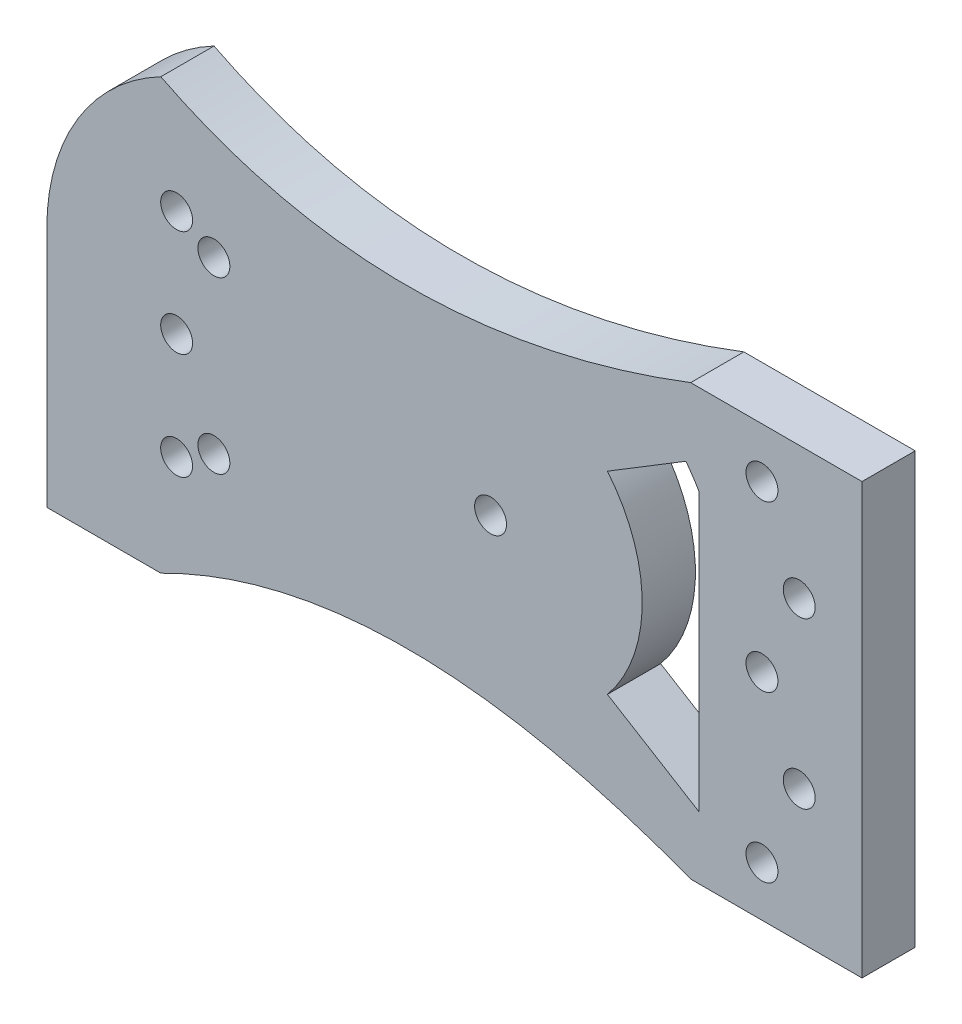
ISO-10303-21;
HEADER;
FILE_DESCRIPTION(('STEP AP214'),'2;1');
FILE_NAME('part.step','',(''),(''),'','','');
FILE_SCHEMA(('AUTOMOTIVE_DESIGN { 1 0 10303 214 1 1 1 1 }'));
ENDSEC;
DATA;
#1=APPLICATION_CONTEXT('core data for automotive mechanical design processes');
#2=APPLICATION_PROTOCOL_DEFINITION('international standard','automotive_design',2000,#1);
#3=PRODUCT_CONTEXT('',#1,'mechanical');
#4=PRODUCT('Part','Part','',(#3));
#5=PRODUCT_RELATED_PRODUCT_CATEGORY('part','',(#4));
#6=PRODUCT_DEFINITION_FORMATION('','',#4);
#7=PRODUCT_DEFINITION_CONTEXT('part definition',#1,'design');
#8=PRODUCT_DEFINITION('design','',#6,#7);
#9=PRODUCT_DEFINITION_SHAPE('','',#8);
#10=(LENGTH_UNIT() NAMED_UNIT(*) SI_UNIT(.MILLI.,.METRE.));
#11=(NAMED_UNIT(*) PLANE_ANGLE_UNIT() SI_UNIT($,.RADIAN.));
#12=(NAMED_UNIT(*) SI_UNIT($,.STERADIAN.) SOLID_ANGLE_UNIT());
#13=UNCERTAINTY_MEASURE_WITH_UNIT(LENGTH_MEASURE(1.E-05),#10,'distance_accuracy_value','');
#14=(GEOMETRIC_REPRESENTATION_CONTEXT(3) GLOBAL_UNCERTAINTY_ASSIGNED_CONTEXT((#13)) GLOBAL_UNIT_ASSIGNED_CONTEXT((#10,
#11,#12)) REPRESENTATION_CONTEXT('',''));
#15=CARTESIAN_POINT('',(0.,0.,0.));
#16=DIRECTION('',(0.,0.,1.));
#17=DIRECTION('',(1.,0.,0.));
#18=AXIS2_PLACEMENT_3D('',#15,#16,#17);
#19=CARTESIAN_POINT('',(0.,0.,5.));
#20=DIRECTION('',(0.,0.,1.));
#21=DIRECTION('',(1.,0.,0.));
#22=AXIS2_PLACEMENT_3D('',#19,#20,#21);
#23=PLANE('',#22);
#24=CARTESIAN_POINT('',(67.,-7.75,5.));
#25=DIRECTION('',(0.,0.,1.));
#26=DIRECTION('',(1.,0.,0.));
#27=AXIS2_PLACEMENT_3D('',#24,#25,#26);
#28=CIRCLE('',#27,1.5);
#29=CARTESIAN_POINT('',(68.5,-7.75,5.));
#30=VERTEX_POINT('',#29);
#31=EDGE_CURVE('E272',#30,#30,#28,.T.);
#32=ORIENTED_EDGE('',*,*,#31,.F.);
#33=EDGE_LOOP('',(#32));
#34=FACE_BOUND('',#33,.T.);
#35=CARTESIAN_POINT('',(63.5,15.5,5.));
#36=DIRECTION('',(0.,0.,1.));
#37=DIRECTION('',(1.,0.,0.));
#38=AXIS2_PLACEMENT_3D('',#35,#36,#37);
#39=CIRCLE('',#38,1.5);
#40=CARTESIAN_POINT('',(65.,15.5,5.));
#41=VERTEX_POINT('',#40);
#42=EDGE_CURVE('E284',#41,#41,#39,.T.);
#43=ORIENTED_EDGE('',*,*,#42,.F.);
#44=EDGE_LOOP('',(#43));
#45=FACE_BOUND('',#44,.T.);
#46=CARTESIAN_POINT('',(38.,0.,5.));
#47=DIRECTION('',(0.,0.,1.));
#48=DIRECTION('',(1.,0.,0.));
#49=AXIS2_PLACEMENT_3D('',#46,#47,#48);
#50=CIRCLE('',#49,1.5);
#51=CARTESIAN_POINT('',(39.5,0.,5.));
#52=VERTEX_POINT('',#51);
#53=EDGE_CURVE('E296',#52,#52,#50,.T.);
#54=ORIENTED_EDGE('',*,*,#53,.F.);
#55=EDGE_LOOP('',(#54));
#56=FACE_BOUND('',#55,.T.);
#57=CARTESIAN_POINT('',(63.5,-15.5,5.));
#58=DIRECTION('',(0.,0.,1.));
#59=DIRECTION('',(1.,0.,0.));
#60=AXIS2_PLACEMENT_3D('',#57,#58,#59);
#61=CIRCLE('',#60,1.5);
#62=CARTESIAN_POINT('',(65.,-15.5,5.));
#63=VERTEX_POINT('',#62);
#64=EDGE_CURVE('E290',#63,#63,#61,.T.);
#65=ORIENTED_EDGE('',*,*,#64,.F.);
#66=EDGE_LOOP('',(#65));
#67=FACE_BOUND('',#66,.T.);
#68=CARTESIAN_POINT('',(63.5,0.,5.));
#69=DIRECTION('',(0.,0.,1.));
#70=DIRECTION('',(1.,0.,0.));
#71=AXIS2_PLACEMENT_3D('',#68,#69,#70);
#72=CIRCLE('',#71,1.5);
#73=CARTESIAN_POINT('',(65.,0.,5.));
#74=VERTEX_POINT('',#73);
#75=EDGE_CURVE('E278',#74,#74,#72,.T.);
#76=ORIENTED_EDGE('',*,*,#75,.F.);
#77=EDGE_LOOP('',(#76));
#78=FACE_BOUND('',#77,.T.);
#79=CARTESIAN_POINT('',(67.,7.75,5.));
#80=DIRECTION('',(0.,0.,1.));
#81=DIRECTION('',(1.,0.,0.));
#82=AXIS2_PLACEMENT_3D('',#79,#80,#81);
#83=CIRCLE('',#82,1.5);
#84=CARTESIAN_POINT('',(68.5,7.75,5.));
#85=VERTEX_POINT('',#84);
#86=EDGE_CURVE('E266',#85,#85,#83,.T.);
#87=ORIENTED_EDGE('',*,*,#86,.F.);
#88=EDGE_LOOP('',(#87));
#89=FACE_BOUND('',#88,.T.);
#90=CARTESIAN_POINT('',(12.,-8.,5.));
#91=DIRECTION('',(0.,0.,1.));
#92=DIRECTION('',(1.,0.,0.));
#93=AXIS2_PLACEMENT_3D('',#90,#91,#92);
#94=CIRCLE('',#93,1.5);
#95=CARTESIAN_POINT('',(13.5,-8.,5.));
#96=VERTEX_POINT('',#95);
#97=EDGE_CURVE('E225',#96,#96,#94,.T.);
#98=ORIENTED_EDGE('',*,*,#97,.F.);
#99=EDGE_LOOP('',(#98));
#100=FACE_BOUND('',#99,.T.);
#101=CARTESIAN_POINT('',(12.,8.,5.));
#102=DIRECTION('',(0.,0.,1.));
#103=DIRECTION('',(1.,0.,0.));
#104=AXIS2_PLACEMENT_3D('',#101,#102,#103);
#105=CIRCLE('',#104,1.5);
#106=CARTESIAN_POINT('',(13.5,8.,5.));
#107=VERTEX_POINT('',#106);
#108=EDGE_CURVE('E248',#107,#107,#105,.T.);
#109=ORIENTED_EDGE('',*,*,#108,.F.);
#110=EDGE_LOOP('',(#109));
#111=FACE_BOUND('',#110,.T.);
#112=CARTESIAN_POINT('',(8.5,10.,5.));
#113=DIRECTION('',(0.,0.,1.));
#114=DIRECTION('',(1.,0.,0.));
#115=AXIS2_PLACEMENT_3D('',#112,#113,#114);
#116=CIRCLE('',#115,1.5);
#117=CARTESIAN_POINT('',(10.,10.,5.));
#118=VERTEX_POINT('',#117);
#119=EDGE_CURVE('E251',#118,#118,#116,.T.);
#120=ORIENTED_EDGE('',*,*,#119,.F.);
#121=EDGE_LOOP('',(#120));
#122=FACE_BOUND('',#121,.T.);
#123=CARTESIAN_POINT('',(8.50000000000001,-10.,5.));
#124=DIRECTION('',(0.,0.,1.));
#125=DIRECTION('',(1.,0.,0.));
#126=AXIS2_PLACEMENT_3D('',#123,#124,#125);
#127=CIRCLE('',#126,1.5);
#128=CARTESIAN_POINT('',(10.,-10.,5.));
#129=VERTEX_POINT('',#128);
#130=EDGE_CURVE('E254',#129,#129,#127,.T.);
#131=ORIENTED_EDGE('',*,*,#130,.F.);
#132=EDGE_LOOP('',(#131));
#133=FACE_BOUND('',#132,.T.);
#134=CARTESIAN_POINT('',(8.5,0.,5.));
#135=DIRECTION('',(0.,0.,1.));
#136=DIRECTION('',(1.,0.,0.));
#137=AXIS2_PLACEMENT_3D('',#134,#135,#136);
#138=CIRCLE('',#137,1.5);
#139=CARTESIAN_POINT('',(10.,0.,5.));
#140=VERTEX_POINT('',#139);
#141=EDGE_CURVE('E257',#140,#140,#138,.T.);
#142=ORIENTED_EDGE('',*,*,#141,.F.);
#143=EDGE_LOOP('',(#142));
#144=FACE_BOUND('',#143,.T.);
#145=CARTESIAN_POINT('',(7.01499768579391,20.2,5.));
#146=CARTESIAN_POINT('',(28.4695540230226,9.32289805055588,5.));
#147=CARTESIAN_POINT('',(56.8,20.2,5.));
#148=B_SPLINE_CURVE_WITH_KNOTS('',2,(#145,#146,#147),.UNSPECIFIED.,.F.,.F.,(3,3),(0.,
0.793600415889483),.UNSPECIFIED.);
#149=CARTESIAN_POINT('',(7.01499768579392,20.2,5.));
#150=VERTEX_POINT('',#149);
#151=CARTESIAN_POINT('',(56.8,20.2,5.));
#152=VERTEX_POINT('',#151);
#153=EDGE_CURVE('E211',#150,#152,#148,.T.);
#154=ORIENTED_EDGE('',*,*,#153,.F.);
#155=CARTESIAN_POINT('',(16.3,2.48591712717854,5.));
#156=DIRECTION('',(0.,0.,1.));
#157=DIRECTION('',(1.,0.,0.));
#158=AXIS2_PLACEMENT_3D('',#155,#156,#157);
#159=CIRCLE('',#158,20.);
#160=CARTESIAN_POINT('',(-3.69999999999999,2.48591712717854,5.));
#161=VERTEX_POINT('',#160);
#162=EDGE_CURVE('E327',#150,#161,#159,.T.);
#163=ORIENTED_EDGE('',*,*,#162,.T.);
#164=DIRECTION('',(0.,-1.,0.));
#165=VECTOR('',#164,1.);
#166=CARTESIAN_POINT('',(-3.69999999999999,20.2,5.));
#167=LINE('',#166,#165);
#168=CARTESIAN_POINT('',(-3.7,-20.1999999999999,5.));
#169=VERTEX_POINT('',#168);
#170=EDGE_CURVE('E260',#161,#169,#167,.T.);
#171=ORIENTED_EDGE('',*,*,#170,.T.);
#172=DIRECTION('',(1.,0.,0.));
#173=VECTOR('',#172,1.);
#174=CARTESIAN_POINT('',(72.9,-20.1999999999999,5.));
#175=LINE('',#174,#173);
#176=CARTESIAN_POINT('',(7.01499768579392,-20.2,5.));
#177=VERTEX_POINT('',#176);
#178=EDGE_CURVE('E310',#169,#177,#175,.T.);
#179=ORIENTED_EDGE('',*,*,#178,.T.);
#180=CARTESIAN_POINT('',(7.01499768579391,-20.2,5.));
#181=CARTESIAN_POINT('',(28.4695540230226,-9.32289805055588,5.));
#182=CARTESIAN_POINT('',(56.8,-20.2,5.));
#183=B_SPLINE_CURVE_WITH_KNOTS('',2,(#180,#181,#182),.UNSPECIFIED.,.F.,.F.,(3,3),(0.,
0.793600415889483),.UNSPECIFIED.);
#184=CARTESIAN_POINT('',(56.8,-20.2,5.));
#185=VERTEX_POINT('',#184);
#186=EDGE_CURVE('E174',#177,#185,#183,.T.);
#187=ORIENTED_EDGE('',*,*,#186,.T.);
#188=CARTESIAN_POINT('',(72.9,-20.1999999999999,5.));
#189=VERTEX_POINT('',#188);
#190=EDGE_CURVE('E309',#185,#189,#175,.T.);
#191=ORIENTED_EDGE('',*,*,#190,.T.);
#192=DIRECTION('',(0.,1.,0.));
#193=VECTOR('',#192,1.);
#194=CARTESIAN_POINT('',(72.9,-20.1999999999999,5.));
#195=LINE('',#194,#193);
#196=CARTESIAN_POINT('',(72.9,20.2,5.));
#197=VERTEX_POINT('',#196);
#198=EDGE_CURVE('E302',#189,#197,#195,.T.);
#199=ORIENTED_EDGE('',*,*,#198,.T.);
#200=DIRECTION('',(-1.,0.,0.));
#201=VECTOR('',#200,1.);
#202=CARTESIAN_POINT('',(72.9,20.2,5.));
#203=LINE('',#202,#201);
#204=EDGE_CURVE('E305',#197,#152,#203,.T.);
#205=ORIENTED_EDGE('',*,*,#204,.T.);
#206=EDGE_LOOP('',(#154,#163,#171,#179,#187,#191,#199,#205));
#207=FACE_BOUND('',#206,.T.);
#208=CARTESIAN_POINT('',(38.,0.,5.));
#209=DIRECTION('',(0.,0.,1.));
#210=DIRECTION('',(1.,0.,0.));
#211=AXIS2_PLACEMENT_3D('',#208,#209,#210);
#212=CIRCLE('',#211,22.8349139531927);
#213=CARTESIAN_POINT('',(57.6062750002091,11.7058650199756,5.));
#214=VERTEX_POINT('',#213);
#215=CARTESIAN_POINT('',(56.357360850304,13.5808909082372,5.));
#216=VERTEX_POINT('',#215);
#217=EDGE_CURVE('E149',#214,#216,#212,.T.);
#218=ORIENTED_EDGE('',*,*,#217,.F.);
#219=DIRECTION('',(0.,-1.,0.));
#220=VECTOR('',#219,1.);
#221=CARTESIAN_POINT('',(57.6062750002091,0.,5.));
#222=LINE('',#221,#220);
#223=CARTESIAN_POINT('',(57.6062750002091,-14.3422499265986,5.));
#224=VERTEX_POINT('',#223);
#225=EDGE_CURVE('E48',#214,#224,#222,.T.);
#226=ORIENTED_EDGE('',*,*,#225,.T.);
#227=DIRECTION('',(-0.853849047805789,0.520520704257907,0.));
#228=VECTOR('',#227,1.);
#229=CARTESIAN_POINT('',(9.23359088954748,15.1465498382211,5.));
#230=LINE('',#229,#228);
#231=CARTESIAN_POINT('',(48.9778159105452,-9.08219650901376,5.));
#232=VERTEX_POINT('',#231);
#233=EDGE_CURVE('E135',#224,#232,#230,.T.);
#234=ORIENTED_EDGE('',*,*,#233,.T.);
#235=CARTESIAN_POINT('',(38.,0.,5.));
#236=DIRECTION('',(0.,0.,1.));
#237=DIRECTION('',(1.,0.,0.));
#238=AXIS2_PLACEMENT_3D('',#235,#236,#237);
#239=CIRCLE('',#238,14.2477624767596);
#240=CARTESIAN_POINT('',(48.9778159105452,9.08219650901376,5.));
#241=VERTEX_POINT('',#240);
#242=EDGE_CURVE('E159',#232,#241,#239,.T.);
#243=ORIENTED_EDGE('',*,*,#242,.T.);
#244=DIRECTION('',(-0.853849047805789,-0.520520704257907,0.));
#245=VECTOR('',#244,1.);
#246=CARTESIAN_POINT('',(9.23359088954749,-15.1465498382211,5.));
#247=LINE('',#246,#245);
#248=EDGE_CURVE('E156',#216,#241,#247,.T.);
#249=ORIENTED_EDGE('',*,*,#248,.F.);
#250=EDGE_LOOP('',(#218,#226,#234,#243,#249));
#251=FACE_BOUND('',#250,.T.);
#252=ADVANCED_FACE('F33',(#34,#45,#56,#67,#78,#89,#100,#111,#122,#133,#144,#207,#251),#23,.T.);
#253=CARTESIAN_POINT('',(0.,0.,0.));
#254=DIRECTION('',(0.,0.,1.));
#255=DIRECTION('',(1.,0.,0.));
#256=AXIS2_PLACEMENT_3D('',#253,#254,#255);
#257=PLANE('',#256);
#258=DIRECTION('',(0.,1.,0.));
#259=VECTOR('',#258,1.);
#260=CARTESIAN_POINT('',(-3.69999999999999,20.2,0.));
#261=LINE('',#260,#259);
#262=CARTESIAN_POINT('',(-3.7,-20.1999999999999,0.));
#263=VERTEX_POINT('',#262);
#264=CARTESIAN_POINT('',(-3.69999999999999,2.48591712717854,0.));
#265=VERTEX_POINT('',#264);
#266=EDGE_CURVE('E239',#263,#265,#261,.T.);
#267=ORIENTED_EDGE('',*,*,#266,.T.);
#268=CARTESIAN_POINT('',(16.3,2.48591712717854,0.));
#269=DIRECTION('',(0.,0.,1.));
#270=DIRECTION('',(1.,0.,0.));
#271=AXIS2_PLACEMENT_3D('',#268,#269,#270);
#272=CIRCLE('',#271,20.);
#273=CARTESIAN_POINT('',(7.01499768579392,20.2,0.));
#274=VERTEX_POINT('',#273);
#275=EDGE_CURVE('E11',#265,#274,#272,.F.);
#276=ORIENTED_EDGE('',*,*,#275,.T.);
#277=CARTESIAN_POINT('',(7.01499768579391,20.2,0.));
#278=CARTESIAN_POINT('',(28.4695540230226,9.32289805055588,0.));
#279=CARTESIAN_POINT('',(56.8,20.2,0.));
#280=B_SPLINE_CURVE_WITH_KNOTS('',2,(#277,#278,#279),.UNSPECIFIED.,.F.,.F.,(3,3),(0.,
0.793600415889483),.UNSPECIFIED.);
#281=CARTESIAN_POINT('',(56.8,20.2,0.));
#282=VERTEX_POINT('',#281);
#283=EDGE_CURVE('E207',#282,#274,#280,.F.);
#284=ORIENTED_EDGE('',*,*,#283,.F.);
#285=DIRECTION('',(-1.,0.,0.));
#286=VECTOR('',#285,1.);
#287=CARTESIAN_POINT('',(72.9,20.2,0.));
#288=LINE('',#287,#286);
#289=CARTESIAN_POINT('',(72.9,20.2,0.));
#290=VERTEX_POINT('',#289);
#291=EDGE_CURVE('E316',#290,#282,#288,.T.);
#292=ORIENTED_EDGE('',*,*,#291,.F.);
#293=DIRECTION('',(0.,1.,0.));
#294=VECTOR('',#293,1.);
#295=CARTESIAN_POINT('',(72.9,-20.1999999999999,0.));
#296=LINE('',#295,#294);
#297=CARTESIAN_POINT('',(72.9,-20.1999999999999,0.));
#298=VERTEX_POINT('',#297);
#299=EDGE_CURVE('E299',#298,#290,#296,.T.);
#300=ORIENTED_EDGE('',*,*,#299,.F.);
#301=DIRECTION('',(1.,0.,0.));
#302=VECTOR('',#301,1.);
#303=CARTESIAN_POINT('',(72.9,-20.1999999999999,0.));
#304=LINE('',#303,#302);
#305=CARTESIAN_POINT('',(56.8,-20.1999999999999,0.));
#306=VERTEX_POINT('',#305);
#307=EDGE_CURVE('E319',#306,#298,#304,.T.);
#308=ORIENTED_EDGE('',*,*,#307,.F.);
#309=CARTESIAN_POINT('',(7.01499768579391,-20.2,0.));
#310=CARTESIAN_POINT('',(28.4695540230226,-9.32289805055588,0.));
#311=CARTESIAN_POINT('',(56.8,-20.2,0.));
#312=B_SPLINE_CURVE_WITH_KNOTS('',2,(#309,#310,#311),.UNSPECIFIED.,.F.,.F.,(3,3),(0.,
0.793600415889483),.UNSPECIFIED.);
#313=CARTESIAN_POINT('',(7.01499768579392,-20.1999999999999,0.));
#314=VERTEX_POINT('',#313);
#315=EDGE_CURVE('E141',#306,#314,#312,.F.);
#316=ORIENTED_EDGE('',*,*,#315,.T.);
#317=EDGE_CURVE('E306',#263,#314,#304,.T.);
#318=ORIENTED_EDGE('',*,*,#317,.F.);
#319=EDGE_LOOP('',(#267,#276,#284,#292,#300,#308,#316,#318));
#320=FACE_BOUND('',#319,.T.);
#321=CARTESIAN_POINT('',(38.,0.,0.));
#322=DIRECTION('',(0.,0.,1.));
#323=DIRECTION('',(1.,0.,0.));
#324=AXIS2_PLACEMENT_3D('',#321,#322,#323);
#325=CIRCLE('',#324,1.5);
#326=CARTESIAN_POINT('',(39.5,0.,0.));
#327=VERTEX_POINT('',#326);
#328=EDGE_CURVE('E293',#327,#327,#325,.T.);
#329=ORIENTED_EDGE('',*,*,#328,.T.);
#330=EDGE_LOOP('',(#329));
#331=FACE_BOUND('',#330,.T.);
#332=CARTESIAN_POINT('',(63.5,-15.5,0.));
#333=DIRECTION('',(0.,0.,1.));
#334=DIRECTION('',(1.,0.,0.));
#335=AXIS2_PLACEMENT_3D('',#332,#333,#334);
#336=CIRCLE('',#335,1.5);
#337=CARTESIAN_POINT('',(65.,-15.5,0.));
#338=VERTEX_POINT('',#337);
#339=EDGE_CURVE('E287',#338,#338,#336,.T.);
#340=ORIENTED_EDGE('',*,*,#339,.T.);
#341=EDGE_LOOP('',(#340));
#342=FACE_BOUND('',#341,.T.);
#343=CARTESIAN_POINT('',(63.5,15.5,0.));
#344=DIRECTION('',(0.,0.,1.));
#345=DIRECTION('',(1.,0.,0.));
#346=AXIS2_PLACEMENT_3D('',#343,#344,#345);
#347=CIRCLE('',#346,1.5);
#348=CARTESIAN_POINT('',(65.,15.5,0.));
#349=VERTEX_POINT('',#348);
#350=EDGE_CURVE('E281',#349,#349,#347,.T.);
#351=ORIENTED_EDGE('',*,*,#350,.T.);
#352=EDGE_LOOP('',(#351));
#353=FACE_BOUND('',#352,.T.);
#354=CARTESIAN_POINT('',(63.5,0.,0.));
#355=DIRECTION('',(0.,0.,1.));
#356=DIRECTION('',(1.,0.,0.));
#357=AXIS2_PLACEMENT_3D('',#354,#355,#356);
#358=CIRCLE('',#357,1.5);
#359=CARTESIAN_POINT('',(65.,0.,0.));
#360=VERTEX_POINT('',#359);
#361=EDGE_CURVE('E275',#360,#360,#358,.T.);
#362=ORIENTED_EDGE('',*,*,#361,.T.);
#363=EDGE_LOOP('',(#362));
#364=FACE_BOUND('',#363,.T.);
#365=CARTESIAN_POINT('',(67.,-7.75,0.));
#366=DIRECTION('',(0.,0.,1.));
#367=DIRECTION('',(1.,0.,0.));
#368=AXIS2_PLACEMENT_3D('',#365,#366,#367);
#369=CIRCLE('',#368,1.5);
#370=CARTESIAN_POINT('',(68.5,-7.75,0.));
#371=VERTEX_POINT('',#370);
#372=EDGE_CURVE('E269',#371,#371,#369,.T.);
#373=ORIENTED_EDGE('',*,*,#372,.T.);
#374=EDGE_LOOP('',(#373));
#375=FACE_BOUND('',#374,.T.);
#376=CARTESIAN_POINT('',(67.,7.75,0.));
#377=DIRECTION('',(0.,0.,1.));
#378=DIRECTION('',(1.,0.,0.));
#379=AXIS2_PLACEMENT_3D('',#376,#377,#378);
#380=CIRCLE('',#379,1.5);
#381=CARTESIAN_POINT('',(68.5,7.75,0.));
#382=VERTEX_POINT('',#381);
#383=EDGE_CURVE('E242',#382,#382,#380,.T.);
#384=ORIENTED_EDGE('',*,*,#383,.T.);
#385=EDGE_LOOP('',(#384));
#386=FACE_BOUND('',#385,.T.);
#387=CARTESIAN_POINT('',(8.50000000000001,-10.,0.));
#388=DIRECTION('',(0.,0.,1.));
#389=DIRECTION('',(1.,0.,0.));
#390=AXIS2_PLACEMENT_3D('',#387,#388,#389);
#391=CIRCLE('',#390,1.5);
#392=CARTESIAN_POINT('',(10.,-10.,0.));
#393=VERTEX_POINT('',#392);
#394=EDGE_CURVE('E232',#393,#393,#391,.F.);
#395=ORIENTED_EDGE('',*,*,#394,.F.);
#396=EDGE_LOOP('',(#395));
#397=FACE_BOUND('',#396,.T.);
#398=CARTESIAN_POINT('',(12.,8.,0.));
#399=DIRECTION('',(0.,0.,1.));
#400=DIRECTION('',(1.,0.,0.));
#401=AXIS2_PLACEMENT_3D('',#398,#399,#400);
#402=CIRCLE('',#401,1.5);
#403=CARTESIAN_POINT('',(13.5,8.,0.));
#404=VERTEX_POINT('',#403);
#405=EDGE_CURVE('E228',#404,#404,#402,.F.);
#406=ORIENTED_EDGE('',*,*,#405,.F.);
#407=EDGE_LOOP('',(#406));
#408=FACE_BOUND('',#407,.T.);
#409=CARTESIAN_POINT('',(12.,-8.,0.));
#410=DIRECTION('',(0.,0.,1.));
#411=DIRECTION('',(1.,0.,0.));
#412=AXIS2_PLACEMENT_3D('',#409,#410,#411);
#413=CIRCLE('',#412,1.5);
#414=CARTESIAN_POINT('',(13.5,-8.,0.));
#415=VERTEX_POINT('',#414);
#416=EDGE_CURVE('E231',#415,#415,#413,.F.);
#417=ORIENTED_EDGE('',*,*,#416,.F.);
#418=EDGE_LOOP('',(#417));
#419=FACE_BOUND('',#418,.T.);
#420=CARTESIAN_POINT('',(8.5,10.,0.));
#421=DIRECTION('',(0.,0.,1.));
#422=DIRECTION('',(1.,0.,0.));
#423=AXIS2_PLACEMENT_3D('',#420,#421,#422);
#424=CIRCLE('',#423,1.5);
#425=CARTESIAN_POINT('',(10.,10.,0.));
#426=VERTEX_POINT('',#425);
#427=EDGE_CURVE('E233',#426,#426,#424,.F.);
#428=ORIENTED_EDGE('',*,*,#427,.F.);
#429=EDGE_LOOP('',(#428));
#430=FACE_BOUND('',#429,.T.);
#431=CARTESIAN_POINT('',(8.5,0.,0.));
#432=DIRECTION('',(0.,0.,1.));
#433=DIRECTION('',(1.,0.,0.));
#434=AXIS2_PLACEMENT_3D('',#431,#432,#433);
#435=CIRCLE('',#434,1.5);
#436=CARTESIAN_POINT('',(10.,0.,0.));
#437=VERTEX_POINT('',#436);
#438=EDGE_CURVE('E236',#437,#437,#435,.F.);
#439=ORIENTED_EDGE('',*,*,#438,.F.);
#440=EDGE_LOOP('',(#439));
#441=FACE_BOUND('',#440,.T.);
#442=DIRECTION('',(0.,1.,0.));
#443=VECTOR('',#442,1.);
#444=CARTESIAN_POINT('',(57.6062750002091,0.,0.));
#445=LINE('',#444,#443);
#446=CARTESIAN_POINT('',(57.6062750002091,-14.3422499265986,0.));
#447=VERTEX_POINT('',#446);
#448=CARTESIAN_POINT('',(57.6062750002091,11.7058650199756,0.));
#449=VERTEX_POINT('',#448);
#450=EDGE_CURVE('E129',#447,#449,#445,.T.);
#451=ORIENTED_EDGE('',*,*,#450,.T.);
#452=CARTESIAN_POINT('',(38.,0.,0.));
#453=DIRECTION('',(0.,0.,1.));
#454=DIRECTION('',(1.,0.,0.));
#455=AXIS2_PLACEMENT_3D('',#452,#453,#454);
#456=CIRCLE('',#455,22.8349139531927);
#457=CARTESIAN_POINT('',(56.357360850304,13.5808909082372,0.));
#458=VERTEX_POINT('',#457);
#459=EDGE_CURVE('E138',#458,#449,#456,.F.);
#460=ORIENTED_EDGE('',*,*,#459,.F.);
#461=DIRECTION('',(0.853849047805789,0.520520704257907,0.));
#462=VECTOR('',#461,1.);
#463=CARTESIAN_POINT('',(9.23359088954749,-15.1465498382211,0.));
#464=LINE('',#463,#462);
#465=CARTESIAN_POINT('',(48.9778159105452,9.08219650901376,0.));
#466=VERTEX_POINT('',#465);
#467=EDGE_CURVE('E56',#466,#458,#464,.T.);
#468=ORIENTED_EDGE('',*,*,#467,.F.);
#469=CARTESIAN_POINT('',(38.,0.,0.));
#470=DIRECTION('',(0.,0.,1.));
#471=DIRECTION('',(1.,0.,0.));
#472=AXIS2_PLACEMENT_3D('',#469,#470,#471);
#473=CIRCLE('',#472,14.2477624767596);
#474=CARTESIAN_POINT('',(48.9778159105452,-9.08219650901376,0.));
#475=VERTEX_POINT('',#474);
#476=EDGE_CURVE('E151',#466,#475,#473,.F.);
#477=ORIENTED_EDGE('',*,*,#476,.T.);
#478=DIRECTION('',(0.853849047805789,-0.520520704257907,0.));
#479=VECTOR('',#478,1.);
#480=CARTESIAN_POINT('',(9.23359088954748,15.1465498382211,0.));
#481=LINE('',#480,#479);
#482=EDGE_CURVE('E147',#475,#447,#481,.T.);
#483=ORIENTED_EDGE('',*,*,#482,.T.);
#484=EDGE_LOOP('',(#451,#460,#468,#477,#483));
#485=FACE_BOUND('',#484,.T.);
#486=ADVANCED_FACE('F144',(#320,#331,#342,#353,#364,#375,#386,#397,#408,#419,#430,#441,#485),
#257,.F.);
#487=CARTESIAN_POINT('',(72.9,-20.1999999999999,5.));
#488=DIRECTION('',(0.,1.,0.));
#489=DIRECTION('',(-1.,0.,0.));
#490=AXIS2_PLACEMENT_3D('',#487,#488,#489);
#491=PLANE('',#490);
#492=DIRECTION('',(0.,0.,1.));
#493=VECTOR('',#492,1.);
#494=CARTESIAN_POINT('',(7.01499768579392,-20.2,-0.00100000000000013));
#495=LINE('',#494,#493);
#496=EDGE_CURVE('E350',#314,#177,#495,.T.);
#497=ORIENTED_EDGE('',*,*,#496,.T.);
#498=ORIENTED_EDGE('',*,*,#178,.F.);
#499=DIRECTION('',(0.,0.,1.));
#500=VECTOR('',#499,1.);
#501=CARTESIAN_POINT('',(-3.7,-20.1999999999999,-53.5835795743434));
#502=LINE('',#501,#500);
#503=EDGE_CURVE('E245',#263,#169,#502,.T.);
#504=ORIENTED_EDGE('',*,*,#503,.F.);
#505=ORIENTED_EDGE('',*,*,#317,.T.);
#506=EDGE_LOOP('',(#497,#498,#504,#505));
#507=FACE_BOUND('',#506,.T.);
#508=ADVANCED_FACE('F363',(#507),#491,.F.);
#509=DIRECTION('',(0.,0.,1.));
#510=VECTOR('',#509,1.);
#511=CARTESIAN_POINT('',(56.8,-20.2,-0.00100000000000013));
#512=LINE('',#511,#510);
#513=EDGE_CURVE('E349',#306,#185,#512,.T.);
#514=ORIENTED_EDGE('',*,*,#513,.F.);
#515=ORIENTED_EDGE('',*,*,#307,.T.);
#516=DIRECTION('',(0.,0.,-1.));
#517=VECTOR('',#516,1.);
#518=CARTESIAN_POINT('',(72.9,-20.1999999999999,5.));
#519=LINE('',#518,#517);
#520=EDGE_CURVE('E313',#189,#298,#519,.T.);
#521=ORIENTED_EDGE('',*,*,#520,.F.);
#522=ORIENTED_EDGE('',*,*,#190,.F.);
#523=EDGE_LOOP('',(#514,#515,#521,#522));
#524=FACE_BOUND('',#523,.T.);
#525=ADVANCED_FACE('F359',(#524),#491,.F.);
#526=CARTESIAN_POINT('',(72.9,-20.1999999999999,5.));
#527=DIRECTION('',(-1.,0.,0.));
#528=DIRECTION('',(0.,0.,1.));
#529=AXIS2_PLACEMENT_3D('',#526,#527,#528);
#530=PLANE('',#529);
#531=ORIENTED_EDGE('',*,*,#299,.T.);
#532=DIRECTION('',(0.,0.,-1.));
#533=VECTOR('',#532,1.);
#534=CARTESIAN_POINT('',(72.9,20.2,5.));
#535=LINE('',#534,#533);
#536=EDGE_CURVE('E324',#197,#290,#535,.T.);
#537=ORIENTED_EDGE('',*,*,#536,.F.);
#538=ORIENTED_EDGE('',*,*,#198,.F.);
#539=ORIENTED_EDGE('',*,*,#520,.T.);
#540=EDGE_LOOP('',(#531,#537,#538,#539));
#541=FACE_BOUND('',#540,.T.);
#542=ADVANCED_FACE('F362',(#541),#530,.F.);
#543=CARTESIAN_POINT('',(72.9,20.2,5.));
#544=DIRECTION('',(0.,-1.,0.));
#545=DIRECTION('',(1.,0.,0.));
#546=AXIS2_PLACEMENT_3D('',#543,#544,#545);
#547=PLANE('',#546);
#548=ORIENTED_EDGE('',*,*,#291,.T.);
#549=DIRECTION('',(0.,0.,1.));
#550=VECTOR('',#549,1.);
#551=CARTESIAN_POINT('',(56.8,20.2,-0.00100000000000013));
#552=LINE('',#551,#550);
#553=EDGE_CURVE('E218',#282,#152,#552,.T.);
#554=ORIENTED_EDGE('',*,*,#553,.T.);
#555=ORIENTED_EDGE('',*,*,#204,.F.);
#556=ORIENTED_EDGE('',*,*,#536,.T.);
#557=EDGE_LOOP('',(#548,#554,#555,#556));
#558=FACE_BOUND('',#557,.T.);
#559=ADVANCED_FACE('F347',(#558),#547,.F.);
#560=CARTESIAN_POINT('',(38.,0.,5.));
#561=DIRECTION('',(0.,0.,-1.));
#562=DIRECTION('',(-1.,0.,0.));
#563=AXIS2_PLACEMENT_3D('',#560,#561,#562);
#564=CYLINDRICAL_SURFACE('',#563,1.5);
#565=ORIENTED_EDGE('',*,*,#53,.T.);
#566=EDGE_LOOP('',(#565));
#567=FACE_BOUND('',#566,.T.);
#568=ORIENTED_EDGE('',*,*,#328,.F.);
#569=EDGE_LOOP('',(#568));
#570=FACE_BOUND('',#569,.T.);
#571=ADVANCED_FACE('F380',(#567,#570),#564,.F.);
#572=CARTESIAN_POINT('',(63.5,-15.5,5.));
#573=DIRECTION('',(0.,0.,-1.));
#574=DIRECTION('',(-1.,0.,0.));
#575=AXIS2_PLACEMENT_3D('',#572,#573,#574);
#576=CYLINDRICAL_SURFACE('',#575,1.5);
#577=ORIENTED_EDGE('',*,*,#64,.T.);
#578=EDGE_LOOP('',(#577));
#579=FACE_BOUND('',#578,.T.);
#580=ORIENTED_EDGE('',*,*,#339,.F.);
#581=EDGE_LOOP('',(#580));
#582=FACE_BOUND('',#581,.T.);
#583=ADVANCED_FACE('F383',(#579,#582),#576,.F.);
#584=CARTESIAN_POINT('',(63.5,15.5,5.));
#585=DIRECTION('',(0.,0.,-1.));
#586=DIRECTION('',(-1.,0.,0.));
#587=AXIS2_PLACEMENT_3D('',#584,#585,#586);
#588=CYLINDRICAL_SURFACE('',#587,1.5);
#589=ORIENTED_EDGE('',*,*,#42,.T.);
#590=EDGE_LOOP('',(#589));
#591=FACE_BOUND('',#590,.T.);
#592=ORIENTED_EDGE('',*,*,#350,.F.);
#593=EDGE_LOOP('',(#592));
#594=FACE_BOUND('',#593,.T.);
#595=ADVANCED_FACE('F387',(#591,#594),#588,.F.);
#596=CARTESIAN_POINT('',(63.5,0.,5.));
#597=DIRECTION('',(0.,0.,-1.));
#598=DIRECTION('',(-1.,0.,0.));
#599=AXIS2_PLACEMENT_3D('',#596,#597,#598);
#600=CYLINDRICAL_SURFACE('',#599,1.5);
#601=ORIENTED_EDGE('',*,*,#75,.T.);
#602=EDGE_LOOP('',(#601));
#603=FACE_BOUND('',#602,.T.);
#604=ORIENTED_EDGE('',*,*,#361,.F.);
#605=EDGE_LOOP('',(#604));
#606=FACE_BOUND('',#605,.T.);
#607=ADVANCED_FACE('F391',(#603,#606),#600,.F.);
#608=CARTESIAN_POINT('',(67.,-7.75,5.));
#609=DIRECTION('',(0.,0.,-1.));
#610=DIRECTION('',(-1.,0.,0.));
#611=AXIS2_PLACEMENT_3D('',#608,#609,#610);
#612=CYLINDRICAL_SURFACE('',#611,1.5);
#613=ORIENTED_EDGE('',*,*,#31,.T.);
#614=EDGE_LOOP('',(#613));
#615=FACE_BOUND('',#614,.T.);
#616=ORIENTED_EDGE('',*,*,#372,.F.);
#617=EDGE_LOOP('',(#616));
#618=FACE_BOUND('',#617,.T.);
#619=ADVANCED_FACE('F395',(#615,#618),#612,.F.);
#620=CARTESIAN_POINT('',(67.,7.75,5.));
#621=DIRECTION('',(0.,0.,-1.));
#622=DIRECTION('',(-1.,0.,0.));
#623=AXIS2_PLACEMENT_3D('',#620,#621,#622);
#624=CYLINDRICAL_SURFACE('',#623,1.5);
#625=ORIENTED_EDGE('',*,*,#86,.T.);
#626=EDGE_LOOP('',(#625));
#627=FACE_BOUND('',#626,.T.);
#628=ORIENTED_EDGE('',*,*,#383,.F.);
#629=EDGE_LOOP('',(#628));
#630=FACE_BOUND('',#629,.T.);
#631=ADVANCED_FACE('F399',(#627,#630),#624,.F.);
#632=CARTESIAN_POINT('',(-3.69999999999999,20.2,-53.5835795743434));
#633=DIRECTION('',(-1.,0.,0.));
#634=DIRECTION('',(0.,-1.,0.));
#635=AXIS2_PLACEMENT_3D('',#632,#633,#634);
#636=PLANE('',#635);
#637=ORIENTED_EDGE('',*,*,#170,.F.);
#638=DIRECTION('',(0.,0.,-1.));
#639=VECTOR('',#638,1.);
#640=CARTESIAN_POINT('',(-3.69999999999999,2.48591712717854,0.));
#641=LINE('',#640,#639);
#642=EDGE_CURVE('E41',#161,#265,#641,.T.);
#643=ORIENTED_EDGE('',*,*,#642,.T.);
#644=ORIENTED_EDGE('',*,*,#266,.F.);
#645=ORIENTED_EDGE('',*,*,#503,.T.);
#646=EDGE_LOOP('',(#637,#643,#644,#645));
#647=FACE_BOUND('',#646,.T.);
#648=ADVANCED_FACE('F332',(#647),#636,.T.);
#649=CARTESIAN_POINT('',(8.5,0.,-53.5835795743434));
#650=DIRECTION('',(0.,0.,1.));
#651=DIRECTION('',(1.,0.,0.));
#652=AXIS2_PLACEMENT_3D('',#649,#650,#651);
#653=CYLINDRICAL_SURFACE('',#652,1.5);
#654=ORIENTED_EDGE('',*,*,#438,.T.);
#655=EDGE_LOOP('',(#654));
#656=FACE_BOUND('',#655,.T.);
#657=ORIENTED_EDGE('',*,*,#141,.T.);
#658=EDGE_LOOP('',(#657));
#659=FACE_BOUND('',#658,.T.);
#660=ADVANCED_FACE('F406',(#656,#659),#653,.F.);
#661=CARTESIAN_POINT('',(8.50000000000001,-10.,-53.5835795743434));
#662=DIRECTION('',(0.,0.,1.));
#663=DIRECTION('',(1.,0.,0.));
#664=AXIS2_PLACEMENT_3D('',#661,#662,#663);
#665=CYLINDRICAL_SURFACE('',#664,1.5);
#666=ORIENTED_EDGE('',*,*,#394,.T.);
#667=EDGE_LOOP('',(#666));
#668=FACE_BOUND('',#667,.T.);
#669=ORIENTED_EDGE('',*,*,#130,.T.);
#670=EDGE_LOOP('',(#669));
#671=FACE_BOUND('',#670,.T.);
#672=ADVANCED_FACE('F409',(#668,#671),#665,.F.);
#673=CARTESIAN_POINT('',(8.5,10.,-53.5835795743434));
#674=DIRECTION('',(0.,0.,1.));
#675=DIRECTION('',(1.,0.,0.));
#676=AXIS2_PLACEMENT_3D('',#673,#674,#675);
#677=CYLINDRICAL_SURFACE('',#676,1.5);
#678=ORIENTED_EDGE('',*,*,#427,.T.);
#679=EDGE_LOOP('',(#678));
#680=FACE_BOUND('',#679,.T.);
#681=ORIENTED_EDGE('',*,*,#119,.T.);
#682=EDGE_LOOP('',(#681));
#683=FACE_BOUND('',#682,.T.);
#684=ADVANCED_FACE('F413',(#680,#683),#677,.F.);
#685=CARTESIAN_POINT('',(12.,8.,-53.5835795743434));
#686=DIRECTION('',(0.,0.,1.));
#687=DIRECTION('',(1.,0.,0.));
#688=AXIS2_PLACEMENT_3D('',#685,#686,#687);
#689=CYLINDRICAL_SURFACE('',#688,1.5);
#690=ORIENTED_EDGE('',*,*,#405,.T.);
#691=EDGE_LOOP('',(#690));
#692=FACE_BOUND('',#691,.T.);
#693=ORIENTED_EDGE('',*,*,#108,.T.);
#694=EDGE_LOOP('',(#693));
#695=FACE_BOUND('',#694,.T.);
#696=ADVANCED_FACE('F416',(#692,#695),#689,.F.);
#697=CARTESIAN_POINT('',(12.,-8.,-53.5835795743434));
#698=DIRECTION('',(0.,0.,1.));
#699=DIRECTION('',(1.,0.,0.));
#700=AXIS2_PLACEMENT_3D('',#697,#698,#699);
#701=CYLINDRICAL_SURFACE('',#700,1.5);
#702=ORIENTED_EDGE('',*,*,#416,.T.);
#703=EDGE_LOOP('',(#702));
#704=FACE_BOUND('',#703,.T.);
#705=ORIENTED_EDGE('',*,*,#97,.T.);
#706=EDGE_LOOP('',(#705));
#707=FACE_BOUND('',#706,.T.);
#708=ADVANCED_FACE('F199',(#704,#707),#701,.F.);
#709=CARTESIAN_POINT('',(7.01499768579391,20.2,-0.00100000000000013));
#710=CARTESIAN_POINT('',(28.4695540230226,9.32289805055588,-0.00100000000000013));
#711=CARTESIAN_POINT('',(56.8,20.2,-0.00100000000000013));
#712=B_SPLINE_CURVE_WITH_KNOTS('',2,(#709,#710,#711),.UNSPECIFIED.,.F.,.F.,(3,3),(0.,
0.793600415889483),.UNSPECIFIED.);
#713=DIRECTION('',(0.,0.,1.));
#714=VECTOR('',#713,1.);
#715=SURFACE_OF_LINEAR_EXTRUSION('',#712,#714);
#716=ORIENTED_EDGE('',*,*,#283,.T.);
#717=DIRECTION('',(0.,0.,1.));
#718=VECTOR('',#717,1.);
#719=CARTESIAN_POINT('',(7.01499768579392,20.2,-0.00100000000000013));
#720=LINE('',#719,#718);
#721=EDGE_CURVE('E219',#274,#150,#720,.T.);
#722=ORIENTED_EDGE('',*,*,#721,.T.);
#723=ORIENTED_EDGE('',*,*,#153,.T.);
#724=ORIENTED_EDGE('',*,*,#553,.F.);
#725=EDGE_LOOP('',(#716,#722,#723,#724));
#726=FACE_BOUND('',#725,.T.);
#727=ADVANCED_FACE('F193',(#726),#715,.F.);
#728=CARTESIAN_POINT('',(7.01499768579391,-20.2,-0.00100000000000013));
#729=CARTESIAN_POINT('',(28.4695540230226,-9.32289805055588,-0.00100000000000013));
#730=CARTESIAN_POINT('',(56.8,-20.2,-0.00100000000000013));
#731=B_SPLINE_CURVE_WITH_KNOTS('',2,(#728,#729,#730),.UNSPECIFIED.,.F.,.F.,(3,3),(0.,
0.793600415889483),.UNSPECIFIED.);
#732=DIRECTION('',(0.,0.,1.));
#733=VECTOR('',#732,1.);
#734=SURFACE_OF_LINEAR_EXTRUSION('',#731,#733);
#735=ORIENTED_EDGE('',*,*,#513,.T.);
#736=ORIENTED_EDGE('',*,*,#186,.F.);
#737=ORIENTED_EDGE('',*,*,#496,.F.);
#738=ORIENTED_EDGE('',*,*,#315,.F.);
#739=EDGE_LOOP('',(#735,#736,#737,#738));
#740=FACE_BOUND('',#739,.T.);
#741=ADVANCED_FACE('F189',(#740),#734,.T.);
#742=CARTESIAN_POINT('',(16.3,2.48591712717854,2.5));
#743=DIRECTION('',(0.,0.,1.));
#744=DIRECTION('',(1.,0.,0.));
#745=AXIS2_PLACEMENT_3D('',#742,#743,#744);
#746=CYLINDRICAL_SURFACE('',#745,20.);
#747=ORIENTED_EDGE('',*,*,#275,.F.);
#748=ORIENTED_EDGE('',*,*,#642,.F.);
#749=ORIENTED_EDGE('',*,*,#162,.F.);
#750=ORIENTED_EDGE('',*,*,#721,.F.);
#751=EDGE_LOOP('',(#747,#748,#749,#750));
#752=FACE_BOUND('',#751,.T.);
#753=ADVANCED_FACE('F35',(#752),#746,.T.);
#754=CARTESIAN_POINT('',(57.6062750002091,0.,-0.00100000000000013));
#755=DIRECTION('',(-1.,0.,0.));
#756=DIRECTION('',(0.,0.,1.));
#757=AXIS2_PLACEMENT_3D('',#754,#755,#756);
#758=PLANE('',#757);
#759=DIRECTION('',(0.,0.,1.));
#760=VECTOR('',#759,1.);
#761=CARTESIAN_POINT('',(57.6062750002091,-14.3422499265986,-0.00100000000000013));
#762=LINE('',#761,#760);
#763=EDGE_CURVE('E142',#447,#224,#762,.T.);
#764=ORIENTED_EDGE('',*,*,#763,.T.);
#765=ORIENTED_EDGE('',*,*,#225,.F.);
#766=DIRECTION('',(0.,0.,1.));
#767=VECTOR('',#766,1.);
#768=CARTESIAN_POINT('',(57.6062750002091,11.7058650199756,-0.00100000000000013));
#769=LINE('',#768,#767);
#770=EDGE_CURVE('E125',#449,#214,#769,.T.);
#771=ORIENTED_EDGE('',*,*,#770,.F.);
#772=ORIENTED_EDGE('',*,*,#450,.F.);
#773=EDGE_LOOP('',(#764,#765,#771,#772));
#774=FACE_BOUND('',#773,.T.);
#775=ADVANCED_FACE('F127',(#774),#758,.T.);
#776=CARTESIAN_POINT('',(9.23359088954748,15.1465498382211,-0.00100000000000013));
#777=DIRECTION('',(0.520520704257907,0.853849047805789,0.));
#778=DIRECTION('',(-0.853849047805789,0.520520704257907,0.));
#779=AXIS2_PLACEMENT_3D('',#776,#777,#778);
#780=PLANE('',#779);
#781=DIRECTION('',(0.,0.,1.));
#782=VECTOR('',#781,1.);
#783=CARTESIAN_POINT('',(48.9778159105452,-9.08219650901376,-0.00100000000000013));
#784=LINE('',#783,#782);
#785=EDGE_CURVE('E165',#475,#232,#784,.T.);
#786=ORIENTED_EDGE('',*,*,#785,.T.);
#787=ORIENTED_EDGE('',*,*,#233,.F.);
#788=ORIENTED_EDGE('',*,*,#763,.F.);
#789=ORIENTED_EDGE('',*,*,#482,.F.);
#790=EDGE_LOOP('',(#786,#787,#788,#789));
#791=FACE_BOUND('',#790,.T.);
#792=ADVANCED_FACE('F471',(#791),#780,.T.);
#793=CARTESIAN_POINT('',(38.,0.,-0.00100000000000013));
#794=DIRECTION('',(0.,0.,1.));
#795=DIRECTION('',(1.,0.,0.));
#796=AXIS2_PLACEMENT_3D('',#793,#794,#795);
#797=CYLINDRICAL_SURFACE('',#796,14.2477624767596);
#798=DIRECTION('',(0.,0.,1.));
#799=VECTOR('',#798,1.);
#800=CARTESIAN_POINT('',(48.9778159105452,9.08219650901376,-0.00100000000000013));
#801=LINE('',#800,#799);
#802=EDGE_CURVE('E167',#466,#241,#801,.T.);
#803=ORIENTED_EDGE('',*,*,#802,.T.);
#804=ORIENTED_EDGE('',*,*,#242,.F.);
#805=ORIENTED_EDGE('',*,*,#785,.F.);
#806=ORIENTED_EDGE('',*,*,#476,.F.);
#807=EDGE_LOOP('',(#803,#804,#805,#806));
#808=FACE_BOUND('',#807,.T.);
#809=ADVANCED_FACE('F478',(#808),#797,.T.);
#810=CARTESIAN_POINT('',(9.23359088954749,-15.1465498382211,-0.00100000000000013));
#811=DIRECTION('',(-0.520520704257907,0.853849047805789,0.));
#812=DIRECTION('',(-0.853849047805789,-0.520520704257907,0.));
#813=AXIS2_PLACEMENT_3D('',#810,#811,#812);
#814=PLANE('',#813);
#815=ORIENTED_EDGE('',*,*,#467,.T.);
#816=DIRECTION('',(0.,0.,1.));
#817=VECTOR('',#816,1.);
#818=CARTESIAN_POINT('',(56.357360850304,13.5808909082372,-0.00100000000000013));
#819=LINE('',#818,#817);
#820=EDGE_CURVE('E134',#458,#216,#819,.T.);
#821=ORIENTED_EDGE('',*,*,#820,.T.);
#822=ORIENTED_EDGE('',*,*,#248,.T.);
#823=ORIENTED_EDGE('',*,*,#802,.F.);
#824=EDGE_LOOP('',(#815,#821,#822,#823));
#825=FACE_BOUND('',#824,.T.);
#826=ADVANCED_FACE('F486',(#825),#814,.F.);
#827=CARTESIAN_POINT('',(38.,0.,-0.00100000000000013));
#828=DIRECTION('',(0.,0.,1.));
#829=DIRECTION('',(1.,0.,0.));
#830=AXIS2_PLACEMENT_3D('',#827,#828,#829);
#831=CYLINDRICAL_SURFACE('',#830,22.8349139531927);
#832=ORIENTED_EDGE('',*,*,#459,.T.);
#833=ORIENTED_EDGE('',*,*,#770,.T.);
#834=ORIENTED_EDGE('',*,*,#217,.T.);
#835=ORIENTED_EDGE('',*,*,#820,.F.);
#836=EDGE_LOOP('',(#832,#833,#834,#835));
#837=FACE_BOUND('',#836,.T.);
#838=ADVANCED_FACE('F139',(#837),#831,.F.);
#839=CLOSED_SHELL('',(#252,#486,#508,#525,#542,#559,#571,#583,#595,#607,#619,#631,#648,#660,
#672,#684,#696,#708,#727,#741,#753,#775,#792,#809,#826,#838));
#840=MANIFOLD_SOLID_BREP('B2',#839);
#841=ADVANCED_BREP_SHAPE_REPRESENTATION('',(#18,#840),#14);
#842=SHAPE_DEFINITION_REPRESENTATION(#9,#841);
ENDSEC;
END-ISO-10303-21;
